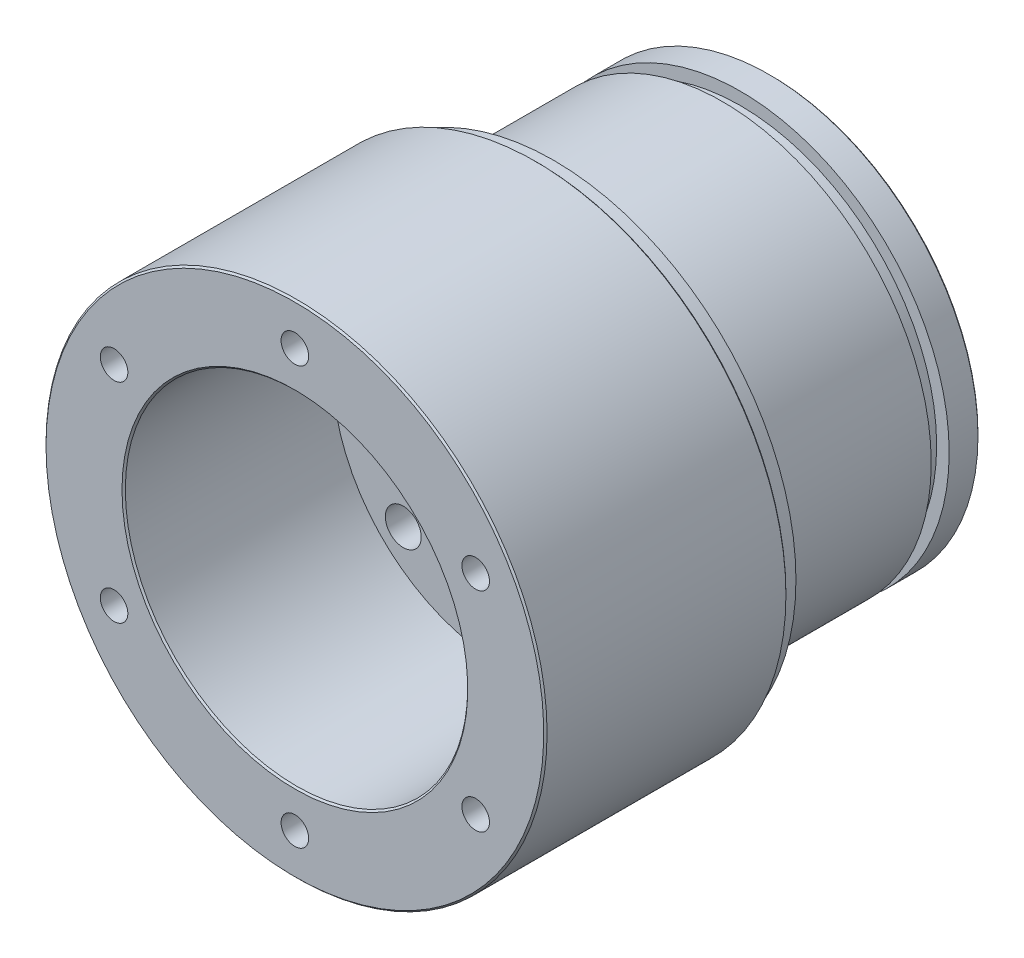
ISO-10303-21;
HEADER;
FILE_DESCRIPTION(('STEP AP214'),'2;1');
FILE_NAME('part.step','',(''),(''),'','','');
FILE_SCHEMA(('AUTOMOTIVE_DESIGN { 1 0 10303 214 1 1 1 1 }'));
ENDSEC;
DATA;
#1=APPLICATION_CONTEXT('core data for automotive mechanical design processes');
#2=APPLICATION_PROTOCOL_DEFINITION('international standard','automotive_design',2000,#1);
#3=PRODUCT_CONTEXT('',#1,'mechanical');
#4=PRODUCT('Part','Part','',(#3));
#5=PRODUCT_RELATED_PRODUCT_CATEGORY('part','',(#4));
#6=PRODUCT_DEFINITION_FORMATION('','',#4);
#7=PRODUCT_DEFINITION_CONTEXT('part definition',#1,'design');
#8=PRODUCT_DEFINITION('design','',#6,#7);
#9=PRODUCT_DEFINITION_SHAPE('','',#8);
#10=(LENGTH_UNIT() NAMED_UNIT(*) SI_UNIT(.MILLI.,.METRE.));
#11=(NAMED_UNIT(*) PLANE_ANGLE_UNIT() SI_UNIT($,.RADIAN.));
#12=(NAMED_UNIT(*) SI_UNIT($,.STERADIAN.) SOLID_ANGLE_UNIT());
#13=UNCERTAINTY_MEASURE_WITH_UNIT(LENGTH_MEASURE(1.E-05),#10,'distance_accuracy_value','');
#14=(GEOMETRIC_REPRESENTATION_CONTEXT(3) GLOBAL_UNCERTAINTY_ASSIGNED_CONTEXT((#13)) GLOBAL_UNIT_ASSIGNED_CONTEXT((#10,
#11,#12)) REPRESENTATION_CONTEXT('',''));
#15=CARTESIAN_POINT('',(0.,0.,0.));
#16=DIRECTION('',(0.,0.,1.));
#17=DIRECTION('',(1.,0.,0.));
#18=AXIS2_PLACEMENT_3D('',#15,#16,#17);
#19=CARTESIAN_POINT('',(0.,0.,0.));
#20=DIRECTION('',(0.,0.,-1.));
#21=DIRECTION('',(1.,0.,0.));
#22=AXIS2_PLACEMENT_3D('',#19,#20,#21);
#23=CYLINDRICAL_SURFACE('',#22,25.);
#24=CARTESIAN_POINT('',(0.,0.,-27.8));
#25=DIRECTION('',(0.,0.,1.));
#26=DIRECTION('',(1.,0.,0.));
#27=AXIS2_PLACEMENT_3D('',#24,#25,#26);
#28=CIRCLE('',#27,25.);
#29=CARTESIAN_POINT('',(25.,0.,-27.8));
#30=VERTEX_POINT('',#29);
#31=EDGE_CURVE('E48',#30,#30,#28,.F.);
#32=ORIENTED_EDGE('',*,*,#31,.F.);
#33=EDGE_LOOP('',(#32));
#34=FACE_BOUND('',#33,.T.);
#35=CARTESIAN_POINT('',(0.,0.,-24.35));
#36=DIRECTION('',(0.,0.,-1.));
#37=DIRECTION('',(-1.,0.,0.));
#38=AXIS2_PLACEMENT_3D('',#35,#36,#37);
#39=CIRCLE('',#38,25.);
#40=CARTESIAN_POINT('',(-25.,0.,-24.35));
#41=VERTEX_POINT('',#40);
#42=EDGE_CURVE('E142',#41,#41,#39,.T.);
#43=ORIENTED_EDGE('',*,*,#42,.T.);
#44=EDGE_LOOP('',(#43));
#45=FACE_BOUND('',#44,.T.);
#46=ADVANCED_FACE('F39',(#34,#45),#23,.T.);
#47=CARTESIAN_POINT('',(0.,0.,-2.));
#48=DIRECTION('',(0.,0.,1.));
#49=DIRECTION('',(1.,0.,0.));
#50=AXIS2_PLACEMENT_3D('',#47,#48,#49);
#51=CIRCLE('',#50,25.);
#52=CARTESIAN_POINT('',(25.,0.,-2.));
#53=VERTEX_POINT('',#52);
#54=EDGE_CURVE('E157',#53,#53,#51,.T.);
#55=ORIENTED_EDGE('',*,*,#54,.F.);
#56=EDGE_LOOP('',(#55));
#57=FACE_BOUND('',#56,.T.);
#58=CARTESIAN_POINT('',(0.,0.,-22.2));
#59=DIRECTION('',(0.,0.,-1.));
#60=DIRECTION('',(-1.,0.,0.));
#61=AXIS2_PLACEMENT_3D('',#58,#59,#60);
#62=CIRCLE('',#61,25.);
#63=CARTESIAN_POINT('',(-25.,0.,-22.2));
#64=VERTEX_POINT('',#63);
#65=EDGE_CURVE('E133',#64,#64,#62,.T.);
#66=ORIENTED_EDGE('',*,*,#65,.F.);
#67=EDGE_LOOP('',(#66));
#68=FACE_BOUND('',#67,.T.);
#69=ADVANCED_FACE('F198',(#57,#68),#23,.T.);
#70=CARTESIAN_POINT('',(0.,0.,0.));
#71=DIRECTION('',(0.,0.,-1.));
#72=DIRECTION('',(1.,0.,0.));
#73=AXIS2_PLACEMENT_3D('',#70,#71,#72);
#74=CYLINDRICAL_SURFACE('',#73,13.);
#75=CARTESIAN_POINT('',(0.,0.,0.));
#76=DIRECTION('',(0.,0.,1.));
#77=DIRECTION('',(1.,0.,0.));
#78=AXIS2_PLACEMENT_3D('',#75,#76,#77);
#79=CIRCLE('',#78,13.);
#80=CARTESIAN_POINT('',(13.,0.,0.));
#81=VERTEX_POINT('',#80);
#82=EDGE_CURVE('E163',#81,#81,#79,.T.);
#83=ORIENTED_EDGE('',*,*,#82,.F.);
#84=EDGE_LOOP('',(#83));
#85=FACE_BOUND('',#84,.T.);
#86=CARTESIAN_POINT('',(0.,0.,4.));
#87=DIRECTION('',(0.,0.,1.));
#88=DIRECTION('',(1.,0.,0.));
#89=AXIS2_PLACEMENT_3D('',#86,#87,#88);
#90=CIRCLE('',#89,13.);
#91=CARTESIAN_POINT('',(13.,0.,4.));
#92=VERTEX_POINT('',#91);
#93=EDGE_CURVE('E145',#92,#92,#90,.T.);
#94=ORIENTED_EDGE('',*,*,#93,.T.);
#95=EDGE_LOOP('',(#94));
#96=FACE_BOUND('',#95,.T.);
#97=ADVANCED_FACE('F223',(#85,#96),#74,.F.);
#98=CARTESIAN_POINT('',(13.,0.,0.));
#99=DIRECTION('',(0.,0.,-1.));
#100=DIRECTION('',(1.,0.,0.));
#101=AXIS2_PLACEMENT_3D('',#98,#99,#100);
#102=PLANE('',#101);
#103=CARTESIAN_POINT('',(12.0208152801712,12.0208152801714,0.));
#104=DIRECTION('',(0.,0.,1.));
#105=DIRECTION('',(0.,-1.,0.));
#106=AXIS2_PLACEMENT_3D('',#103,#104,#105);
#107=CIRCLE('',#106,2.15);
#108=CARTESIAN_POINT('',(12.0208152801712,9.87081528017138,0.));
#109=VERTEX_POINT('',#108);
#110=EDGE_CURVE('E112',#109,#109,#107,.T.);
#111=ORIENTED_EDGE('',*,*,#110,.T.);
#112=EDGE_LOOP('',(#111));
#113=FACE_BOUND('',#112,.T.);
#114=CARTESIAN_POINT('',(12.0208152801712,-12.0208152801714,0.));
#115=DIRECTION('',(0.,0.,1.));
#116=DIRECTION('',(1.,0.,0.));
#117=AXIS2_PLACEMENT_3D('',#114,#115,#116);
#118=CIRCLE('',#117,2.15);
#119=CARTESIAN_POINT('',(14.1708152801712,-12.0208152801714,0.));
#120=VERTEX_POINT('',#119);
#121=EDGE_CURVE('E118',#120,#120,#118,.T.);
#122=ORIENTED_EDGE('',*,*,#121,.T.);
#123=EDGE_LOOP('',(#122));
#124=FACE_BOUND('',#123,.T.);
#125=CARTESIAN_POINT('',(-12.0208152801713,-12.0208152801713,0.));
#126=DIRECTION('',(0.,0.,1.));
#127=DIRECTION('',(0.,-1.,0.));
#128=AXIS2_PLACEMENT_3D('',#125,#126,#127);
#129=CIRCLE('',#128,2.15);
#130=CARTESIAN_POINT('',(-12.0208152801713,-14.1708152801713,0.));
#131=VERTEX_POINT('',#130);
#132=EDGE_CURVE('E121',#131,#131,#129,.T.);
#133=ORIENTED_EDGE('',*,*,#132,.T.);
#134=EDGE_LOOP('',(#133));
#135=FACE_BOUND('',#134,.T.);
#136=CARTESIAN_POINT('',(-12.0208152801712,12.0208152801714,0.));
#137=DIRECTION('',(0.,0.,1.));
#138=DIRECTION('',(1.,0.,0.));
#139=AXIS2_PLACEMENT_3D('',#136,#137,#138);
#140=CIRCLE('',#139,2.15);
#141=CARTESIAN_POINT('',(-9.87081528017125,12.0208152801714,0.));
#142=VERTEX_POINT('',#141);
#143=EDGE_CURVE('E127',#142,#142,#140,.T.);
#144=ORIENTED_EDGE('',*,*,#143,.T.);
#145=EDGE_LOOP('',(#144));
#146=FACE_BOUND('',#145,.T.);
#147=CARTESIAN_POINT('',(0.,0.,0.));
#148=DIRECTION('',(0.,0.,1.));
#149=DIRECTION('',(1.,0.,0.));
#150=AXIS2_PLACEMENT_3D('',#147,#148,#149);
#151=CIRCLE('',#150,21.);
#152=CARTESIAN_POINT('',(21.,0.,0.));
#153=VERTEX_POINT('',#152);
#154=EDGE_CURVE('E160',#153,#153,#151,.T.);
#155=ORIENTED_EDGE('',*,*,#154,.F.);
#156=EDGE_LOOP('',(#155));
#157=FACE_BOUND('',#156,.T.);
#158=ORIENTED_EDGE('',*,*,#82,.T.);
#159=EDGE_LOOP('',(#158));
#160=FACE_BOUND('',#159,.T.);
#161=ADVANCED_FACE('F228',(#113,#124,#135,#146,#157,#160),#102,.T.);
#162=CARTESIAN_POINT('',(0.,0.,0.));
#163=DIRECTION('',(0.,0.,-1.));
#164=DIRECTION('',(1.,0.,0.));
#165=AXIS2_PLACEMENT_3D('',#162,#163,#164);
#166=CYLINDRICAL_SURFACE('',#165,21.);
#167=CARTESIAN_POINT('',(0.,0.,-27.8));
#168=DIRECTION('',(0.,0.,1.));
#169=DIRECTION('',(1.,0.,0.));
#170=AXIS2_PLACEMENT_3D('',#167,#168,#169);
#171=CIRCLE('',#170,21.);
#172=CARTESIAN_POINT('',(21.,0.,-27.8));
#173=VERTEX_POINT('',#172);
#174=EDGE_CURVE('E11',#173,#173,#171,.T.);
#175=ORIENTED_EDGE('',*,*,#174,.F.);
#176=EDGE_LOOP('',(#175));
#177=FACE_BOUND('',#176,.T.);
#178=ORIENTED_EDGE('',*,*,#154,.T.);
#179=EDGE_LOOP('',(#178));
#180=FACE_BOUND('',#179,.T.);
#181=ADVANCED_FACE('F239',(#177,#180),#166,.F.);
#182=CARTESIAN_POINT('',(21.,0.,-28.));
#183=DIRECTION('',(0.,0.,-1.));
#184=DIRECTION('',(1.,0.,0.));
#185=AXIS2_PLACEMENT_3D('',#182,#183,#184);
#186=PLANE('',#185);
#187=CARTESIAN_POINT('',(0.,0.,-28.));
#188=DIRECTION('',(0.,0.,1.));
#189=DIRECTION('',(1.,0.,0.));
#190=AXIS2_PLACEMENT_3D('',#187,#188,#189);
#191=CIRCLE('',#190,24.8);
#192=CARTESIAN_POINT('',(24.8,0.,-28.));
#193=VERTEX_POINT('',#192);
#194=EDGE_CURVE('E187',#193,#193,#191,.T.);
#195=ORIENTED_EDGE('',*,*,#194,.F.);
#196=EDGE_LOOP('',(#195));
#197=FACE_BOUND('',#196,.T.);
#198=CARTESIAN_POINT('',(0.,0.,-28.));
#199=DIRECTION('',(0.,0.,1.));
#200=DIRECTION('',(1.,0.,0.));
#201=AXIS2_PLACEMENT_3D('',#198,#199,#200);
#202=CIRCLE('',#201,21.2);
#203=CARTESIAN_POINT('',(21.2,0.,-28.));
#204=VERTEX_POINT('',#203);
#205=EDGE_CURVE('E184',#204,#204,#202,.F.);
#206=ORIENTED_EDGE('',*,*,#205,.F.);
#207=EDGE_LOOP('',(#206));
#208=FACE_BOUND('',#207,.T.);
#209=ADVANCED_FACE('F236',(#197,#208),#186,.T.);
#210=CARTESIAN_POINT('',(25.,0.,-2.));
#211=DIRECTION('',(0.,0.,-1.));
#212=DIRECTION('',(1.,0.,0.));
#213=AXIS2_PLACEMENT_3D('',#210,#211,#212);
#214=PLANE('',#213);
#215=CARTESIAN_POINT('',(0.,0.,-2.));
#216=DIRECTION('',(0.,0.,1.));
#217=DIRECTION('',(1.,0.,0.));
#218=AXIS2_PLACEMENT_3D('',#215,#216,#217);
#219=CIRCLE('',#218,29.);
#220=CARTESIAN_POINT('',(29.,0.,-2.));
#221=VERTEX_POINT('',#220);
#222=EDGE_CURVE('E154',#221,#221,#219,.T.);
#223=ORIENTED_EDGE('',*,*,#222,.F.);
#224=EDGE_LOOP('',(#223));
#225=FACE_BOUND('',#224,.T.);
#226=ORIENTED_EDGE('',*,*,#54,.T.);
#227=EDGE_LOOP('',(#226));
#228=FACE_BOUND('',#227,.T.);
#229=ADVANCED_FACE('F234',(#225,#228),#214,.T.);
#230=CARTESIAN_POINT('',(0.,0.,0.));
#231=DIRECTION('',(0.,0.,-1.));
#232=DIRECTION('',(1.,0.,0.));
#233=AXIS2_PLACEMENT_3D('',#230,#231,#232);
#234=CYLINDRICAL_SURFACE('',#233,29.);
#235=CARTESIAN_POINT('',(0.,0.,0.));
#236=DIRECTION('',(0.,0.,1.));
#237=DIRECTION('',(1.,0.,0.));
#238=AXIS2_PLACEMENT_3D('',#235,#236,#237);
#239=CIRCLE('',#238,29.);
#240=CARTESIAN_POINT('',(29.,0.,0.));
#241=VERTEX_POINT('',#240);
#242=EDGE_CURVE('E151',#241,#241,#239,.T.);
#243=ORIENTED_EDGE('',*,*,#242,.F.);
#244=EDGE_LOOP('',(#243));
#245=FACE_BOUND('',#244,.T.);
#246=ORIENTED_EDGE('',*,*,#222,.T.);
#247=EDGE_LOOP('',(#246));
#248=FACE_BOUND('',#247,.T.);
#249=ADVANCED_FACE('F304',(#245,#248),#234,.T.);
#250=CARTESIAN_POINT('',(29.,0.,0.));
#251=DIRECTION('',(0.,0.,-1.));
#252=DIRECTION('',(1.,0.,0.));
#253=AXIS2_PLACEMENT_3D('',#250,#251,#252);
#254=PLANE('',#253);
#255=CARTESIAN_POINT('',(0.,0.,0.));
#256=DIRECTION('',(0.,0.,1.));
#257=DIRECTION('',(1.,0.,0.));
#258=AXIS2_PLACEMENT_3D('',#255,#256,#257);
#259=CIRCLE('',#258,29.8);
#260=CARTESIAN_POINT('',(29.8,0.,0.));
#261=VERTEX_POINT('',#260);
#262=EDGE_CURVE('E166',#261,#261,#259,.T.);
#263=ORIENTED_EDGE('',*,*,#262,.F.);
#264=EDGE_LOOP('',(#263));
#265=FACE_BOUND('',#264,.T.);
#266=ORIENTED_EDGE('',*,*,#242,.T.);
#267=EDGE_LOOP('',(#266));
#268=FACE_BOUND('',#267,.T.);
#269=ADVANCED_FACE('F301',(#265,#268),#254,.T.);
#270=CARTESIAN_POINT('',(0.,0.,0.));
#271=DIRECTION('',(0.,0.,-1.));
#272=DIRECTION('',(1.,0.,0.));
#273=AXIS2_PLACEMENT_3D('',#270,#271,#272);
#274=CYLINDRICAL_SURFACE('',#273,30.);
#275=CARTESIAN_POINT('',(0.,0.,0.200000000000023));
#276=DIRECTION('',(0.,0.,1.));
#277=DIRECTION('',(1.,0.,0.));
#278=AXIS2_PLACEMENT_3D('',#275,#276,#277);
#279=CIRCLE('',#278,30.);
#280=CARTESIAN_POINT('',(30.,0.,0.200000000000023));
#281=VERTEX_POINT('',#280);
#282=EDGE_CURVE('E172',#281,#281,#279,.F.);
#283=ORIENTED_EDGE('',*,*,#282,.F.);
#284=EDGE_LOOP('',(#283));
#285=FACE_BOUND('',#284,.T.);
#286=CARTESIAN_POINT('',(0.,0.,28.8));
#287=DIRECTION('',(0.,0.,-1.));
#288=DIRECTION('',(-1.,0.,0.));
#289=AXIS2_PLACEMENT_3D('',#286,#287,#288);
#290=CIRCLE('',#289,30.);
#291=CARTESIAN_POINT('',(-30.,0.,28.8));
#292=VERTEX_POINT('',#291);
#293=EDGE_CURVE('E169',#292,#292,#290,.F.);
#294=ORIENTED_EDGE('',*,*,#293,.F.);
#295=EDGE_LOOP('',(#294));
#296=FACE_BOUND('',#295,.T.);
#297=ADVANCED_FACE('F294',(#285,#296),#274,.T.);
#298=CARTESIAN_POINT('',(30.,0.,29.));
#299=DIRECTION('',(0.,0.,1.));
#300=DIRECTION('',(-1.,0.,0.));
#301=AXIS2_PLACEMENT_3D('',#298,#299,#300);
#302=PLANE('',#301);
#303=CARTESIAN_POINT('',(-21.6506350946108,12.5000000000003,29.));
#304=DIRECTION('',(0.,0.,-1.));
#305=DIRECTION('',(0.,1.,0.));
#306=AXIS2_PLACEMENT_3D('',#303,#304,#305);
#307=CIRCLE('',#306,1.65);
#308=CARTESIAN_POINT('',(-21.6506350946108,14.1500000000003,29.));
#309=VERTEX_POINT('',#308);
#310=EDGE_CURVE('E78',#309,#309,#307,.T.);
#311=ORIENTED_EDGE('',*,*,#310,.T.);
#312=EDGE_LOOP('',(#311));
#313=FACE_BOUND('',#312,.T.);
#314=CARTESIAN_POINT('',(-21.6506350946111,-12.4999999999998,29.));
#315=DIRECTION('',(0.,0.,-1.));
#316=DIRECTION('',(0.,1.,0.));
#317=AXIS2_PLACEMENT_3D('',#314,#315,#316);
#318=CIRCLE('',#317,1.65);
#319=CARTESIAN_POINT('',(-21.6506350946111,-10.8499999999998,29.));
#320=VERTEX_POINT('',#319);
#321=EDGE_CURVE('E77',#320,#320,#318,.T.);
#322=ORIENTED_EDGE('',*,*,#321,.T.);
#323=EDGE_LOOP('',(#322));
#324=FACE_BOUND('',#323,.T.);
#325=CARTESIAN_POINT('',(0.,-25.,29.));
#326=DIRECTION('',(0.,0.,-1.));
#327=DIRECTION('',(-1.,0.,0.));
#328=AXIS2_PLACEMENT_3D('',#325,#326,#327);
#329=CIRCLE('',#328,1.65);
#330=CARTESIAN_POINT('',(-1.65,-25.,29.));
#331=VERTEX_POINT('',#330);
#332=EDGE_CURVE('E88',#331,#331,#329,.T.);
#333=ORIENTED_EDGE('',*,*,#332,.T.);
#334=EDGE_LOOP('',(#333));
#335=FACE_BOUND('',#334,.T.);
#336=CARTESIAN_POINT('',(21.6506350946109,-12.5000000000001,29.));
#337=DIRECTION('',(0.,0.,-1.));
#338=DIRECTION('',(0.,1.,0.));
#339=AXIS2_PLACEMENT_3D('',#336,#337,#338);
#340=CIRCLE('',#339,1.65);
#341=CARTESIAN_POINT('',(21.6506350946109,-10.8500000000001,29.));
#342=VERTEX_POINT('',#341);
#343=EDGE_CURVE('E94',#342,#342,#340,.T.);
#344=ORIENTED_EDGE('',*,*,#343,.T.);
#345=EDGE_LOOP('',(#344));
#346=FACE_BOUND('',#345,.T.);
#347=CARTESIAN_POINT('',(21.650635094611,12.5,29.));
#348=DIRECTION('',(0.,0.,-1.));
#349=DIRECTION('',(0.,1.,0.));
#350=AXIS2_PLACEMENT_3D('',#347,#348,#349);
#351=CIRCLE('',#350,1.65);
#352=CARTESIAN_POINT('',(21.650635094611,14.1499999999999,29.));
#353=VERTEX_POINT('',#352);
#354=EDGE_CURVE('E100',#353,#353,#351,.T.);
#355=ORIENTED_EDGE('',*,*,#354,.T.);
#356=EDGE_LOOP('',(#355));
#357=FACE_BOUND('',#356,.T.);
#358=CARTESIAN_POINT('',(0.,25.,29.));
#359=DIRECTION('',(0.,0.,-1.));
#360=DIRECTION('',(-1.,0.,0.));
#361=AXIS2_PLACEMENT_3D('',#358,#359,#360);
#362=CIRCLE('',#361,1.65);
#363=CARTESIAN_POINT('',(-1.65,25.,29.));
#364=VERTEX_POINT('',#363);
#365=EDGE_CURVE('E106',#364,#364,#362,.T.);
#366=ORIENTED_EDGE('',*,*,#365,.T.);
#367=EDGE_LOOP('',(#366));
#368=FACE_BOUND('',#367,.T.);
#369=CARTESIAN_POINT('',(0.,0.,29.));
#370=DIRECTION('',(0.,0.,-1.));
#371=DIRECTION('',(-1.,0.,0.));
#372=AXIS2_PLACEMENT_3D('',#369,#370,#371);
#373=CIRCLE('',#372,20.7);
#374=CARTESIAN_POINT('',(-20.7,0.,29.));
#375=VERTEX_POINT('',#374);
#376=EDGE_CURVE('E178',#375,#375,#373,.F.);
#377=ORIENTED_EDGE('',*,*,#376,.F.);
#378=EDGE_LOOP('',(#377));
#379=FACE_BOUND('',#378,.T.);
#380=CARTESIAN_POINT('',(0.,0.,29.));
#381=DIRECTION('',(0.,0.,-1.));
#382=DIRECTION('',(-1.,0.,0.));
#383=AXIS2_PLACEMENT_3D('',#380,#381,#382);
#384=CIRCLE('',#383,29.8);
#385=CARTESIAN_POINT('',(-29.8,0.,29.));
#386=VERTEX_POINT('',#385);
#387=EDGE_CURVE('E175',#386,#386,#384,.T.);
#388=ORIENTED_EDGE('',*,*,#387,.F.);
#389=EDGE_LOOP('',(#388));
#390=FACE_BOUND('',#389,.T.);
#391=ADVANCED_FACE('F288',(#313,#324,#335,#346,#357,#368,#379,#390),#302,.T.);
#392=CARTESIAN_POINT('',(0.,0.,0.));
#393=DIRECTION('',(0.,0.,-1.));
#394=DIRECTION('',(1.,0.,0.));
#395=AXIS2_PLACEMENT_3D('',#392,#393,#394);
#396=CYLINDRICAL_SURFACE('',#395,20.5);
#397=CARTESIAN_POINT('',(0.,0.,28.8));
#398=DIRECTION('',(0.,0.,-1.));
#399=DIRECTION('',(-1.,0.,0.));
#400=AXIS2_PLACEMENT_3D('',#397,#398,#399);
#401=CIRCLE('',#400,20.5);
#402=CARTESIAN_POINT('',(-20.5,0.,28.8));
#403=VERTEX_POINT('',#402);
#404=EDGE_CURVE('E181',#403,#403,#401,.T.);
#405=ORIENTED_EDGE('',*,*,#404,.F.);
#406=EDGE_LOOP('',(#405));
#407=FACE_BOUND('',#406,.T.);
#408=CARTESIAN_POINT('',(0.,0.,4.));
#409=DIRECTION('',(0.,0.,1.));
#410=DIRECTION('',(1.,0.,0.));
#411=AXIS2_PLACEMENT_3D('',#408,#409,#410);
#412=CIRCLE('',#411,20.5);
#413=CARTESIAN_POINT('',(20.5,0.,4.));
#414=VERTEX_POINT('',#413);
#415=EDGE_CURVE('E148',#414,#414,#412,.T.);
#416=ORIENTED_EDGE('',*,*,#415,.F.);
#417=EDGE_LOOP('',(#416));
#418=FACE_BOUND('',#417,.T.);
#419=ADVANCED_FACE('F282',(#407,#418),#396,.F.);
#420=CARTESIAN_POINT('',(20.5,0.,4.));
#421=DIRECTION('',(0.,0.,1.));
#422=DIRECTION('',(-1.,0.,0.));
#423=AXIS2_PLACEMENT_3D('',#420,#421,#422);
#424=PLANE('',#423);
#425=CARTESIAN_POINT('',(12.0208152801712,12.0208152801714,4.));
#426=DIRECTION('',(0.,0.,-1.));
#427=DIRECTION('',(-1.,0.,0.));
#428=AXIS2_PLACEMENT_3D('',#425,#426,#427);
#429=CIRCLE('',#428,2.15);
#430=CARTESIAN_POINT('',(9.87081528017125,12.0208152801714,4.));
#431=VERTEX_POINT('',#430);
#432=EDGE_CURVE('E115',#431,#431,#429,.T.);
#433=ORIENTED_EDGE('',*,*,#432,.T.);
#434=EDGE_LOOP('',(#433));
#435=FACE_BOUND('',#434,.T.);
#436=CARTESIAN_POINT('',(12.0208152801712,-12.0208152801714,4.));
#437=DIRECTION('',(0.,0.,-1.));
#438=DIRECTION('',(-1.,0.,0.));
#439=AXIS2_PLACEMENT_3D('',#436,#437,#438);
#440=CIRCLE('',#439,2.15);
#441=CARTESIAN_POINT('',(9.87081528017125,-12.0208152801714,4.));
#442=VERTEX_POINT('',#441);
#443=EDGE_CURVE('E43',#442,#442,#440,.T.);
#444=ORIENTED_EDGE('',*,*,#443,.T.);
#445=EDGE_LOOP('',(#444));
#446=FACE_BOUND('',#445,.T.);
#447=CARTESIAN_POINT('',(-12.0208152801713,-12.0208152801713,4.));
#448=DIRECTION('',(0.,0.,-1.));
#449=DIRECTION('',(-1.,0.,0.));
#450=AXIS2_PLACEMENT_3D('',#447,#448,#449);
#451=CIRCLE('',#450,2.15);
#452=CARTESIAN_POINT('',(-14.1708152801713,-12.0208152801713,4.));
#453=VERTEX_POINT('',#452);
#454=EDGE_CURVE('E124',#453,#453,#451,.T.);
#455=ORIENTED_EDGE('',*,*,#454,.T.);
#456=EDGE_LOOP('',(#455));
#457=FACE_BOUND('',#456,.T.);
#458=CARTESIAN_POINT('',(-12.0208152801712,12.0208152801714,4.));
#459=DIRECTION('',(0.,0.,-1.));
#460=DIRECTION('',(-1.,0.,0.));
#461=AXIS2_PLACEMENT_3D('',#458,#459,#460);
#462=CIRCLE('',#461,2.15);
#463=CARTESIAN_POINT('',(-14.1708152801712,12.0208152801714,4.));
#464=VERTEX_POINT('',#463);
#465=EDGE_CURVE('E130',#464,#464,#462,.T.);
#466=ORIENTED_EDGE('',*,*,#465,.T.);
#467=EDGE_LOOP('',(#466));
#468=FACE_BOUND('',#467,.T.);
#469=ORIENTED_EDGE('',*,*,#93,.F.);
#470=EDGE_LOOP('',(#469));
#471=FACE_BOUND('',#470,.T.);
#472=ORIENTED_EDGE('',*,*,#415,.T.);
#473=EDGE_LOOP('',(#472));
#474=FACE_BOUND('',#473,.T.);
#475=ADVANCED_FACE('F206',(#435,#446,#457,#468,#471,#474),#424,.T.);
#476=CARTESIAN_POINT('',(25.,0.,-24.35));
#477=DIRECTION('',(0.,0.,1.));
#478=DIRECTION('',(-1.,0.,0.));
#479=AXIS2_PLACEMENT_3D('',#476,#477,#478);
#480=PLANE('',#479);
#481=ORIENTED_EDGE('',*,*,#42,.F.);
#482=EDGE_LOOP('',(#481));
#483=FACE_BOUND('',#482,.T.);
#484=CARTESIAN_POINT('',(0.,0.,-24.35));
#485=DIRECTION('',(0.,0.,-1.));
#486=DIRECTION('',(-1.,0.,0.));
#487=AXIS2_PLACEMENT_3D('',#484,#485,#486);
#488=CIRCLE('',#487,23.5);
#489=CARTESIAN_POINT('',(-23.5,0.,-24.35));
#490=VERTEX_POINT('',#489);
#491=EDGE_CURVE('E139',#490,#490,#488,.T.);
#492=ORIENTED_EDGE('',*,*,#491,.T.);
#493=EDGE_LOOP('',(#492));
#494=FACE_BOUND('',#493,.T.);
#495=ADVANCED_FACE('F202',(#483,#494),#480,.T.);
#496=CARTESIAN_POINT('',(0.,0.,0.));
#497=DIRECTION('',(0.,0.,1.));
#498=DIRECTION('',(-1.,0.,0.));
#499=AXIS2_PLACEMENT_3D('',#496,#497,#498);
#500=CYLINDRICAL_SURFACE('',#499,23.5);
#501=ORIENTED_EDGE('',*,*,#491,.F.);
#502=EDGE_LOOP('',(#501));
#503=FACE_BOUND('',#502,.T.);
#504=CARTESIAN_POINT('',(0.,0.,-22.2));
#505=DIRECTION('',(0.,0.,-1.));
#506=DIRECTION('',(-1.,0.,0.));
#507=AXIS2_PLACEMENT_3D('',#504,#505,#506);
#508=CIRCLE('',#507,23.5);
#509=CARTESIAN_POINT('',(-23.5,0.,-22.2));
#510=VERTEX_POINT('',#509);
#511=EDGE_CURVE('E136',#510,#510,#508,.T.);
#512=ORIENTED_EDGE('',*,*,#511,.T.);
#513=EDGE_LOOP('',(#512));
#514=FACE_BOUND('',#513,.T.);
#515=ADVANCED_FACE('F205',(#503,#514),#500,.T.);
#516=CARTESIAN_POINT('',(25.,0.,-22.2));
#517=DIRECTION('',(0.,0.,-1.));
#518=DIRECTION('',(1.,0.,0.));
#519=AXIS2_PLACEMENT_3D('',#516,#517,#518);
#520=PLANE('',#519);
#521=ORIENTED_EDGE('',*,*,#511,.F.);
#522=EDGE_LOOP('',(#521));
#523=FACE_BOUND('',#522,.T.);
#524=ORIENTED_EDGE('',*,*,#65,.T.);
#525=EDGE_LOOP('',(#524));
#526=FACE_BOUND('',#525,.T.);
#527=ADVANCED_FACE('F212',(#523,#526),#520,.T.);
#528=CARTESIAN_POINT('',(0.,0.,0.));
#529=DIRECTION('',(0.,0.,1.));
#530=DIRECTION('',(-1.,0.,0.));
#531=AXIS2_PLACEMENT_3D('',#528,#529,#530);
#532=CONICAL_SURFACE('',#531,29.8,0.785398163397431);
#533=ORIENTED_EDGE('',*,*,#282,.T.);
#534=EDGE_LOOP('',(#533));
#535=FACE_BOUND('',#534,.T.);
#536=ORIENTED_EDGE('',*,*,#262,.T.);
#537=EDGE_LOOP('',(#536));
#538=FACE_BOUND('',#537,.T.);
#539=ADVANCED_FACE('F218',(#535,#538),#532,.T.);
#540=CARTESIAN_POINT('',(0.,0.,29.));
#541=DIRECTION('',(0.,0.,1.));
#542=DIRECTION('',(-1.,0.,0.));
#543=AXIS2_PLACEMENT_3D('',#540,#541,#542);
#544=CONICAL_SURFACE('',#543,20.7,0.785398163397457);
#545=ORIENTED_EDGE('',*,*,#404,.T.);
#546=EDGE_LOOP('',(#545));
#547=FACE_BOUND('',#546,.T.);
#548=ORIENTED_EDGE('',*,*,#376,.T.);
#549=EDGE_LOOP('',(#548));
#550=FACE_BOUND('',#549,.T.);
#551=ADVANCED_FACE('F249',(#547,#550),#544,.F.);
#552=CARTESIAN_POINT('',(0.,0.,28.8));
#553=DIRECTION('',(0.,0.,-1.));
#554=DIRECTION('',(1.,0.,0.));
#555=AXIS2_PLACEMENT_3D('',#552,#553,#554);
#556=CONICAL_SURFACE('',#555,30.,0.78539816339744);
#557=ORIENTED_EDGE('',*,*,#387,.T.);
#558=EDGE_LOOP('',(#557));
#559=FACE_BOUND('',#558,.T.);
#560=ORIENTED_EDGE('',*,*,#293,.T.);
#561=EDGE_LOOP('',(#560));
#562=FACE_BOUND('',#561,.T.);
#563=ADVANCED_FACE('F253',(#559,#562),#556,.T.);
#564=CARTESIAN_POINT('',(0.,0.,-28.));
#565=DIRECTION('',(0.,0.,1.));
#566=DIRECTION('',(-1.,0.,0.));
#567=AXIS2_PLACEMENT_3D('',#564,#565,#566);
#568=CONICAL_SURFACE('',#567,24.8,0.785398163397457);
#569=ORIENTED_EDGE('',*,*,#31,.T.);
#570=EDGE_LOOP('',(#569));
#571=FACE_BOUND('',#570,.T.);
#572=ORIENTED_EDGE('',*,*,#194,.T.);
#573=EDGE_LOOP('',(#572));
#574=FACE_BOUND('',#573,.T.);
#575=ADVANCED_FACE('F193',(#571,#574),#568,.T.);
#576=CARTESIAN_POINT('',(0.,0.,-27.8));
#577=DIRECTION('',(0.,0.,-1.));
#578=DIRECTION('',(1.,0.,0.));
#579=AXIS2_PLACEMENT_3D('',#576,#577,#578);
#580=CONICAL_SURFACE('',#579,21.,0.785398163397414);
#581=ORIENTED_EDGE('',*,*,#205,.T.);
#582=EDGE_LOOP('',(#581));
#583=FACE_BOUND('',#582,.T.);
#584=ORIENTED_EDGE('',*,*,#174,.T.);
#585=EDGE_LOOP('',(#584));
#586=FACE_BOUND('',#585,.T.);
#587=ADVANCED_FACE('F41',(#583,#586),#580,.F.);
#588=CARTESIAN_POINT('',(-12.0208152801712,12.0208152801714,0.));
#589=DIRECTION('',(0.,0.,-1.));
#590=DIRECTION('',(1.,0.,0.));
#591=AXIS2_PLACEMENT_3D('',#588,#589,#590);
#592=CYLINDRICAL_SURFACE('',#591,2.15);
#593=ORIENTED_EDGE('',*,*,#465,.F.);
#594=EDGE_LOOP('',(#593));
#595=FACE_BOUND('',#594,.T.);
#596=ORIENTED_EDGE('',*,*,#143,.F.);
#597=EDGE_LOOP('',(#596));
#598=FACE_BOUND('',#597,.T.);
#599=ADVANCED_FACE('F261',(#595,#598),#592,.F.);
#600=CARTESIAN_POINT('',(-12.0208152801713,-12.0208152801713,0.));
#601=DIRECTION('',(0.,0.,-1.));
#602=DIRECTION('',(0.,-1.,0.));
#603=AXIS2_PLACEMENT_3D('',#600,#601,#602);
#604=CYLINDRICAL_SURFACE('',#603,2.15);
#605=ORIENTED_EDGE('',*,*,#454,.F.);
#606=EDGE_LOOP('',(#605));
#607=FACE_BOUND('',#606,.T.);
#608=ORIENTED_EDGE('',*,*,#132,.F.);
#609=EDGE_LOOP('',(#608));
#610=FACE_BOUND('',#609,.T.);
#611=ADVANCED_FACE('F266',(#607,#610),#604,.F.);
#612=CARTESIAN_POINT('',(12.0208152801712,-12.0208152801714,0.));
#613=DIRECTION('',(0.,0.,-1.));
#614=DIRECTION('',(1.,0.,0.));
#615=AXIS2_PLACEMENT_3D('',#612,#613,#614);
#616=CYLINDRICAL_SURFACE('',#615,2.15);
#617=ORIENTED_EDGE('',*,*,#443,.F.);
#618=EDGE_LOOP('',(#617));
#619=FACE_BOUND('',#618,.T.);
#620=ORIENTED_EDGE('',*,*,#121,.F.);
#621=EDGE_LOOP('',(#620));
#622=FACE_BOUND('',#621,.T.);
#623=ADVANCED_FACE('F434',(#619,#622),#616,.F.);
#624=CARTESIAN_POINT('',(12.0208152801712,12.0208152801714,0.));
#625=DIRECTION('',(0.,0.,-1.));
#626=DIRECTION('',(0.,-1.,0.));
#627=AXIS2_PLACEMENT_3D('',#624,#625,#626);
#628=CYLINDRICAL_SURFACE('',#627,2.15);
#629=ORIENTED_EDGE('',*,*,#432,.F.);
#630=EDGE_LOOP('',(#629));
#631=FACE_BOUND('',#630,.T.);
#632=ORIENTED_EDGE('',*,*,#110,.F.);
#633=EDGE_LOOP('',(#632));
#634=FACE_BOUND('',#633,.T.);
#635=ADVANCED_FACE('F443',(#631,#634),#628,.F.);
#636=CARTESIAN_POINT('',(0.,25.,18.9));
#637=DIRECTION('',(0.,0.,1.));
#638=DIRECTION('',(-1.,0.,0.));
#639=AXIS2_PLACEMENT_3D('',#636,#637,#638);
#640=CONICAL_SURFACE('',#639,1.65,1.02974425867665);
#641=CARTESIAN_POINT('',(0.,25.,17.9085799786045));
#642=VERTEX_POINT('',#641);
#643=VERTEX_LOOP('',#642);
#644=FACE_BOUND('',#643,.T.);
#645=CARTESIAN_POINT('',(0.,25.,18.9));
#646=DIRECTION('',(0.,0.,-1.));
#647=DIRECTION('',(-1.,0.,0.));
#648=AXIS2_PLACEMENT_3D('',#645,#646,#647);
#649=CIRCLE('',#648,1.65);
#650=CARTESIAN_POINT('',(-1.65,25.,18.9));
#651=VERTEX_POINT('',#650);
#652=EDGE_CURVE('E109',#651,#651,#649,.T.);
#653=ORIENTED_EDGE('',*,*,#652,.F.);
#654=EDGE_LOOP('',(#653));
#655=FACE_BOUND('',#654,.T.);
#656=ADVANCED_FACE('F452',(#644,#655),#640,.F.);
#657=CARTESIAN_POINT('',(0.,25.,29.));
#658=DIRECTION('',(0.,0.,1.));
#659=DIRECTION('',(-1.,0.,0.));
#660=AXIS2_PLACEMENT_3D('',#657,#658,#659);
#661=CYLINDRICAL_SURFACE('',#660,1.65);
#662=ORIENTED_EDGE('',*,*,#652,.T.);
#663=EDGE_LOOP('',(#662));
#664=FACE_BOUND('',#663,.T.);
#665=ORIENTED_EDGE('',*,*,#365,.F.);
#666=EDGE_LOOP('',(#665));
#667=FACE_BOUND('',#666,.T.);
#668=ADVANCED_FACE('F461',(#664,#667),#661,.F.);
#669=CARTESIAN_POINT('',(21.650635094611,12.5,18.9));
#670=DIRECTION('',(0.,0.,1.));
#671=DIRECTION('',(0.,1.,0.));
#672=AXIS2_PLACEMENT_3D('',#669,#670,#671);
#673=CONICAL_SURFACE('',#672,1.65,1.02974425867665);
#674=CARTESIAN_POINT('',(21.650635094611,12.5,17.9085799786045));
#675=VERTEX_POINT('',#674);
#676=VERTEX_LOOP('',#675);
#677=FACE_BOUND('',#676,.T.);
#678=CARTESIAN_POINT('',(21.650635094611,12.5,18.9));
#679=DIRECTION('',(0.,0.,-1.));
#680=DIRECTION('',(0.,1.,0.));
#681=AXIS2_PLACEMENT_3D('',#678,#679,#680);
#682=CIRCLE('',#681,1.65);
#683=CARTESIAN_POINT('',(21.650635094611,14.1499999999999,18.9));
#684=VERTEX_POINT('',#683);
#685=EDGE_CURVE('E103',#684,#684,#682,.T.);
#686=ORIENTED_EDGE('',*,*,#685,.F.);
#687=EDGE_LOOP('',(#686));
#688=FACE_BOUND('',#687,.T.);
#689=ADVANCED_FACE('F470',(#677,#688),#673,.F.);
#690=CARTESIAN_POINT('',(21.650635094611,12.5,29.));
#691=DIRECTION('',(0.,0.,1.));
#692=DIRECTION('',(0.,1.,0.));
#693=AXIS2_PLACEMENT_3D('',#690,#691,#692);
#694=CYLINDRICAL_SURFACE('',#693,1.65);
#695=ORIENTED_EDGE('',*,*,#685,.T.);
#696=EDGE_LOOP('',(#695));
#697=FACE_BOUND('',#696,.T.);
#698=ORIENTED_EDGE('',*,*,#354,.F.);
#699=EDGE_LOOP('',(#698));
#700=FACE_BOUND('',#699,.T.);
#701=ADVANCED_FACE('F482',(#697,#700),#694,.F.);
#702=CARTESIAN_POINT('',(21.6506350946109,-12.5000000000001,18.9));
#703=DIRECTION('',(0.,0.,1.));
#704=DIRECTION('',(0.,1.,0.));
#705=AXIS2_PLACEMENT_3D('',#702,#703,#704);
#706=CONICAL_SURFACE('',#705,1.65,1.02974425867665);
#707=CARTESIAN_POINT('',(21.6506350946109,-12.5000000000001,17.9085799786045));
#708=VERTEX_POINT('',#707);
#709=VERTEX_LOOP('',#708);
#710=FACE_BOUND('',#709,.T.);
#711=CARTESIAN_POINT('',(21.6506350946109,-12.5000000000001,18.9));
#712=DIRECTION('',(0.,0.,-1.));
#713=DIRECTION('',(0.,1.,0.));
#714=AXIS2_PLACEMENT_3D('',#711,#712,#713);
#715=CIRCLE('',#714,1.65);
#716=CARTESIAN_POINT('',(21.6506350946109,-10.8500000000001,18.9));
#717=VERTEX_POINT('',#716);
#718=EDGE_CURVE('E97',#717,#717,#715,.T.);
#719=ORIENTED_EDGE('',*,*,#718,.F.);
#720=EDGE_LOOP('',(#719));
#721=FACE_BOUND('',#720,.T.);
#722=ADVANCED_FACE('F491',(#710,#721),#706,.F.);
#723=CARTESIAN_POINT('',(21.6506350946109,-12.5000000000001,29.));
#724=DIRECTION('',(0.,0.,1.));
#725=DIRECTION('',(0.,1.,0.));
#726=AXIS2_PLACEMENT_3D('',#723,#724,#725);
#727=CYLINDRICAL_SURFACE('',#726,1.65);
#728=ORIENTED_EDGE('',*,*,#718,.T.);
#729=EDGE_LOOP('',(#728));
#730=FACE_BOUND('',#729,.T.);
#731=ORIENTED_EDGE('',*,*,#343,.F.);
#732=EDGE_LOOP('',(#731));
#733=FACE_BOUND('',#732,.T.);
#734=ADVANCED_FACE('F503',(#730,#733),#727,.F.);
#735=CARTESIAN_POINT('',(0.,-25.,18.9));
#736=DIRECTION('',(0.,0.,1.));
#737=DIRECTION('',(-1.,0.,0.));
#738=AXIS2_PLACEMENT_3D('',#735,#736,#737);
#739=CONICAL_SURFACE('',#738,1.65,1.02974425867665);
#740=CARTESIAN_POINT('',(0.,-25.,17.9085799786045));
#741=VERTEX_POINT('',#740);
#742=VERTEX_LOOP('',#741);
#743=FACE_BOUND('',#742,.T.);
#744=CARTESIAN_POINT('',(0.,-25.,18.9));
#745=DIRECTION('',(0.,0.,-1.));
#746=DIRECTION('',(-1.,0.,0.));
#747=AXIS2_PLACEMENT_3D('',#744,#745,#746);
#748=CIRCLE('',#747,1.65);
#749=CARTESIAN_POINT('',(-1.65,-25.,18.9));
#750=VERTEX_POINT('',#749);
#751=EDGE_CURVE('E91',#750,#750,#748,.T.);
#752=ORIENTED_EDGE('',*,*,#751,.F.);
#753=EDGE_LOOP('',(#752));
#754=FACE_BOUND('',#753,.T.);
#755=ADVANCED_FACE('F513',(#743,#754),#739,.F.);
#756=CARTESIAN_POINT('',(0.,-25.,29.));
#757=DIRECTION('',(0.,0.,1.));
#758=DIRECTION('',(-1.,0.,0.));
#759=AXIS2_PLACEMENT_3D('',#756,#757,#758);
#760=CYLINDRICAL_SURFACE('',#759,1.65);
#761=ORIENTED_EDGE('',*,*,#751,.T.);
#762=EDGE_LOOP('',(#761));
#763=FACE_BOUND('',#762,.T.);
#764=ORIENTED_EDGE('',*,*,#332,.F.);
#765=EDGE_LOOP('',(#764));
#766=FACE_BOUND('',#765,.T.);
#767=ADVANCED_FACE('F525',(#763,#766),#760,.F.);
#768=CARTESIAN_POINT('',(-21.6506350946111,-12.4999999999998,18.9));
#769=DIRECTION('',(0.,0.,1.));
#770=DIRECTION('',(0.,1.,0.));
#771=AXIS2_PLACEMENT_3D('',#768,#769,#770);
#772=CONICAL_SURFACE('',#771,1.65,1.02974425867665);
#773=CARTESIAN_POINT('',(-21.6506350946111,-12.4999999999998,17.9085799786045));
#774=VERTEX_POINT('',#773);
#775=VERTEX_LOOP('',#774);
#776=FACE_BOUND('',#775,.T.);
#777=CARTESIAN_POINT('',(-21.6506350946111,-12.4999999999998,18.9));
#778=DIRECTION('',(0.,0.,-1.));
#779=DIRECTION('',(0.,1.,0.));
#780=AXIS2_PLACEMENT_3D('',#777,#778,#779);
#781=CIRCLE('',#780,1.65);
#782=CARTESIAN_POINT('',(-21.6506350946111,-10.8499999999998,18.9));
#783=VERTEX_POINT('',#782);
#784=EDGE_CURVE('E81',#783,#783,#781,.T.);
#785=ORIENTED_EDGE('',*,*,#784,.F.);
#786=EDGE_LOOP('',(#785));
#787=FACE_BOUND('',#786,.T.);
#788=ADVANCED_FACE('F534',(#776,#787),#772,.F.);
#789=CARTESIAN_POINT('',(-21.6506350946111,-12.4999999999998,29.));
#790=DIRECTION('',(0.,0.,1.));
#791=DIRECTION('',(0.,1.,0.));
#792=AXIS2_PLACEMENT_3D('',#789,#790,#791);
#793=CYLINDRICAL_SURFACE('',#792,1.65);
#794=ORIENTED_EDGE('',*,*,#784,.T.);
#795=EDGE_LOOP('',(#794));
#796=FACE_BOUND('',#795,.T.);
#797=ORIENTED_EDGE('',*,*,#321,.F.);
#798=EDGE_LOOP('',(#797));
#799=FACE_BOUND('',#798,.T.);
#800=ADVANCED_FACE('F71',(#796,#799),#793,.F.);
#801=CARTESIAN_POINT('',(-21.6506350946108,12.5000000000003,18.9));
#802=DIRECTION('',(0.,0.,1.));
#803=DIRECTION('',(0.,1.,0.));
#804=AXIS2_PLACEMENT_3D('',#801,#802,#803);
#805=CONICAL_SURFACE('',#804,1.65,1.02974425867665);
#806=CARTESIAN_POINT('',(-21.6506350946108,12.5000000000003,17.9085799786045));
#807=VERTEX_POINT('',#806);
#808=VERTEX_LOOP('',#807);
#809=FACE_BOUND('',#808,.T.);
#810=CARTESIAN_POINT('',(-21.6506350946108,12.5000000000003,18.9));
#811=DIRECTION('',(0.,0.,-1.));
#812=DIRECTION('',(0.,1.,0.));
#813=AXIS2_PLACEMENT_3D('',#810,#811,#812);
#814=CIRCLE('',#813,1.65);
#815=CARTESIAN_POINT('',(-21.6506350946108,14.1500000000003,18.9));
#816=VERTEX_POINT('',#815);
#817=EDGE_CURVE('E75',#816,#816,#814,.T.);
#818=ORIENTED_EDGE('',*,*,#817,.F.);
#819=EDGE_LOOP('',(#818));
#820=FACE_BOUND('',#819,.T.);
#821=ADVANCED_FACE('F67',(#809,#820),#805,.F.);
#822=CARTESIAN_POINT('',(-21.6506350946108,12.5000000000003,29.));
#823=DIRECTION('',(0.,0.,1.));
#824=DIRECTION('',(0.,1.,0.));
#825=AXIS2_PLACEMENT_3D('',#822,#823,#824);
#826=CYLINDRICAL_SURFACE('',#825,1.65);
#827=ORIENTED_EDGE('',*,*,#817,.T.);
#828=EDGE_LOOP('',(#827));
#829=FACE_BOUND('',#828,.T.);
#830=ORIENTED_EDGE('',*,*,#310,.F.);
#831=EDGE_LOOP('',(#830));
#832=FACE_BOUND('',#831,.T.);
#833=ADVANCED_FACE('F70',(#829,#832),#826,.F.);
#834=CLOSED_SHELL('',(#46,#69,#97,#161,#181,#209,#229,#249,#269,#297,#391,#419,#475,#495,#515,
#527,#539,#551,#563,#575,#587,#599,#611,#623,#635,#656,#668,#689,#701,#722,#734,#755,#767,#788,
#800,#821,#833));
#835=MANIFOLD_SOLID_BREP('B2',#834);
#836=ADVANCED_BREP_SHAPE_REPRESENTATION('',(#18,#835),#14);
#837=SHAPE_DEFINITION_REPRESENTATION(#9,#836);
ENDSEC;
END-ISO-10303-21;
